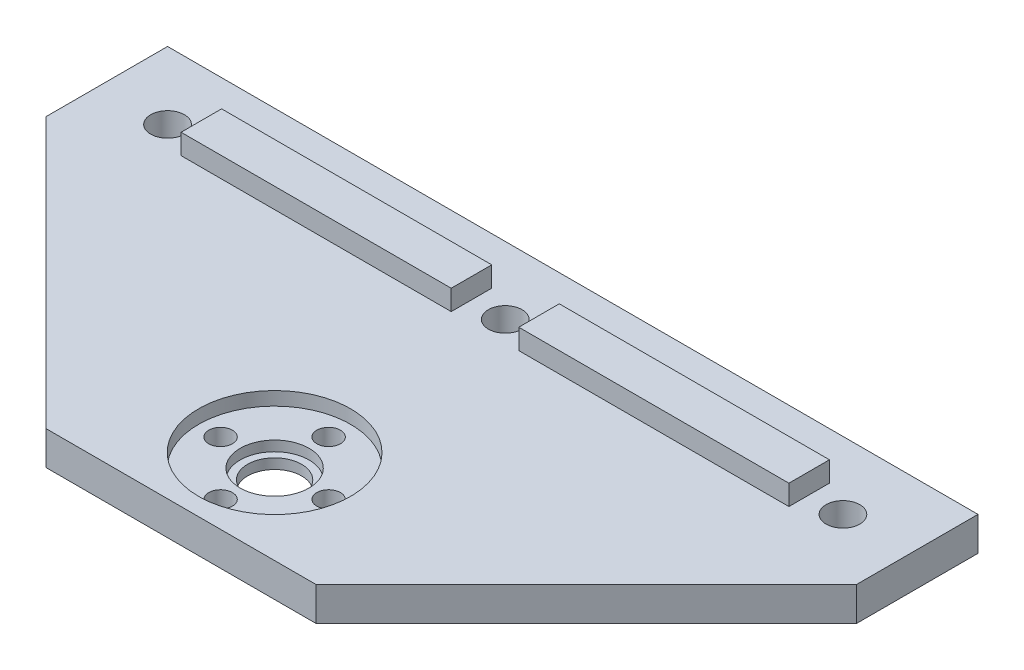
ISO-10303-21;
HEADER;
FILE_DESCRIPTION(('STEP AP214'),'2;1');
FILE_NAME('part.step','',(''),(''),'','','');
FILE_SCHEMA(('AUTOMOTIVE_DESIGN { 1 0 10303 214 1 1 1 1 }'));
ENDSEC;
DATA;
#1=APPLICATION_CONTEXT('core data for automotive mechanical design processes');
#2=APPLICATION_PROTOCOL_DEFINITION('international standard','automotive_design',2000,#1);
#3=PRODUCT_CONTEXT('',#1,'mechanical');
#4=PRODUCT('Part','Part','',(#3));
#5=PRODUCT_RELATED_PRODUCT_CATEGORY('part','',(#4));
#6=PRODUCT_DEFINITION_FORMATION('','',#4);
#7=PRODUCT_DEFINITION_CONTEXT('part definition',#1,'design');
#8=PRODUCT_DEFINITION('design','',#6,#7);
#9=PRODUCT_DEFINITION_SHAPE('','',#8);
#10=(LENGTH_UNIT() NAMED_UNIT(*) SI_UNIT(.MILLI.,.METRE.));
#11=(NAMED_UNIT(*) PLANE_ANGLE_UNIT() SI_UNIT($,.RADIAN.));
#12=(NAMED_UNIT(*) SI_UNIT($,.STERADIAN.) SOLID_ANGLE_UNIT());
#13=UNCERTAINTY_MEASURE_WITH_UNIT(LENGTH_MEASURE(1.E-05),#10,'distance_accuracy_value','');
#14=(GEOMETRIC_REPRESENTATION_CONTEXT(3) GLOBAL_UNCERTAINTY_ASSIGNED_CONTEXT((#13)) GLOBAL_UNIT_ASSIGNED_CONTEXT((#10,
#11,#12)) REPRESENTATION_CONTEXT('',''));
#15=CARTESIAN_POINT('',(0.,0.,0.));
#16=DIRECTION('',(0.,0.,1.));
#17=DIRECTION('',(1.,0.,0.));
#18=AXIS2_PLACEMENT_3D('',#15,#16,#17);
#19=CARTESIAN_POINT('',(60.,-9.,-13.85));
#20=DIRECTION('',(0.,1.,0.));
#21=DIRECTION('',(0.,0.,1.));
#22=AXIS2_PLACEMENT_3D('',#19,#20,#21);
#23=CYLINDRICAL_SURFACE('',#22,4.00000000000001);
#24=CARTESIAN_POINT('',(60.,0.,-13.85));
#25=DIRECTION('',(0.,-1.,0.));
#26=DIRECTION('',(0.,0.,-1.));
#27=AXIS2_PLACEMENT_3D('',#24,#25,#26);
#28=CIRCLE('',#27,4.00000000000001);
#29=CARTESIAN_POINT('',(60.,0.,-17.85));
#30=VERTEX_POINT('',#29);
#31=EDGE_CURVE('E242',#30,#30,#28,.T.);
#32=ORIENTED_EDGE('',*,*,#31,.T.);
#33=EDGE_LOOP('',(#32));
#34=FACE_BOUND('',#33,.T.);
#35=CARTESIAN_POINT('',(60.,1.5,-13.85));
#36=DIRECTION('',(0.,1.,0.));
#37=DIRECTION('',(0.,0.,1.));
#38=AXIS2_PLACEMENT_3D('',#35,#36,#37);
#39=CIRCLE('',#38,4.00000000000001);
#40=CARTESIAN_POINT('',(60.,1.5,-9.84999999999999));
#41=VERTEX_POINT('',#40);
#42=EDGE_CURVE('E246',#41,#41,#39,.F.);
#43=ORIENTED_EDGE('',*,*,#42,.F.);
#44=EDGE_LOOP('',(#43));
#45=FACE_BOUND('',#44,.T.);
#46=ADVANCED_FACE('F33',(#34,#45),#23,.F.);
#47=CARTESIAN_POINT('',(0.,5.,0.));
#48=DIRECTION('',(0.,-1.,0.));
#49=DIRECTION('',(0.,0.,-1.));
#50=AXIS2_PLACEMENT_3D('',#47,#48,#49);
#51=PLANE('',#50);
#52=CARTESIAN_POINT('',(60.,5.,-13.85));
#53=DIRECTION('',(0.,1.,0.));
#54=DIRECTION('',(0.,0.,1.));
#55=AXIS2_PLACEMENT_3D('',#52,#53,#54);
#56=CIRCLE('',#55,11.25);
#57=CARTESIAN_POINT('',(60.,5.,-2.60000000000001));
#58=VERTEX_POINT('',#57);
#59=EDGE_CURVE('E245',#58,#58,#56,.T.);
#60=ORIENTED_EDGE('',*,*,#59,.F.);
#61=EDGE_LOOP('',(#60));
#62=FACE_BOUND('',#61,.T.);
#63=DIRECTION('',(0.,0.,1.));
#64=VECTOR('',#63,1.);
#65=CARTESIAN_POINT('',(15.,5.,-45.));
#66=LINE('',#65,#64);
#67=CARTESIAN_POINT('',(15.,5.,-51.));
#68=VERTEX_POINT('',#67);
#69=CARTESIAN_POINT('',(15.,5.,-45.));
#70=VERTEX_POINT('',#69);
#71=EDGE_CURVE('E162',#68,#70,#66,.T.);
#72=ORIENTED_EDGE('',*,*,#71,.F.);
#73=DIRECTION('',(-1.,0.,0.));
#74=VECTOR('',#73,1.);
#75=CARTESIAN_POINT('',(15.,5.,-51.));
#76=LINE('',#75,#74);
#77=CARTESIAN_POINT('',(55.,5.,-51.));
#78=VERTEX_POINT('',#77);
#79=EDGE_CURVE('E175',#78,#68,#76,.T.);
#80=ORIENTED_EDGE('',*,*,#79,.F.);
#81=DIRECTION('',(0.,0.,-1.));
#82=VECTOR('',#81,1.);
#83=CARTESIAN_POINT('',(55.,5.,-45.));
#84=LINE('',#83,#82);
#85=CARTESIAN_POINT('',(55.,5.,-45.));
#86=VERTEX_POINT('',#85);
#87=EDGE_CURVE('E184',#86,#78,#84,.T.);
#88=ORIENTED_EDGE('',*,*,#87,.F.);
#89=DIRECTION('',(1.,0.,0.));
#90=VECTOR('',#89,1.);
#91=CARTESIAN_POINT('',(15.,5.,-45.));
#92=LINE('',#91,#90);
#93=EDGE_CURVE('E165',#70,#86,#92,.T.);
#94=ORIENTED_EDGE('',*,*,#93,.F.);
#95=EDGE_LOOP('',(#72,#80,#88,#94));
#96=FACE_BOUND('',#95,.T.);
#97=CARTESIAN_POINT('',(10.,5.,-48.));
#98=DIRECTION('',(0.,1.,0.));
#99=DIRECTION('',(0.,0.,1.));
#100=AXIS2_PLACEMENT_3D('',#97,#98,#99);
#101=CIRCLE('',#100,2.5);
#102=CARTESIAN_POINT('',(10.,5.,-45.5));
#103=VERTEX_POINT('',#102);
#104=EDGE_CURVE('E205',#103,#103,#101,.T.);
#105=ORIENTED_EDGE('',*,*,#104,.F.);
#106=EDGE_LOOP('',(#105));
#107=FACE_BOUND('',#106,.T.);
#108=CARTESIAN_POINT('',(60.,5.,-48.));
#109=DIRECTION('',(0.,1.,0.));
#110=DIRECTION('',(0.,0.,1.));
#111=AXIS2_PLACEMENT_3D('',#108,#109,#110);
#112=CIRCLE('',#111,2.5);
#113=CARTESIAN_POINT('',(60.,5.,-45.5));
#114=VERTEX_POINT('',#113);
#115=EDGE_CURVE('E211',#114,#114,#112,.T.);
#116=ORIENTED_EDGE('',*,*,#115,.F.);
#117=EDGE_LOOP('',(#116));
#118=FACE_BOUND('',#117,.T.);
#119=CARTESIAN_POINT('',(110.,5.,-48.));
#120=DIRECTION('',(0.,1.,0.));
#121=DIRECTION('',(0.,0.,1.));
#122=AXIS2_PLACEMENT_3D('',#119,#120,#121);
#123=CIRCLE('',#122,2.50000000000001);
#124=CARTESIAN_POINT('',(110.,5.,-45.5));
#125=VERTEX_POINT('',#124);
#126=EDGE_CURVE('E200',#125,#125,#123,.T.);
#127=ORIENTED_EDGE('',*,*,#126,.F.);
#128=EDGE_LOOP('',(#127));
#129=FACE_BOUND('',#128,.T.);
#130=DIRECTION('',(0.,0.,1.));
#131=VECTOR('',#130,1.);
#132=CARTESIAN_POINT('',(0.,5.,0.));
#133=LINE('',#132,#131);
#134=CARTESIAN_POINT('',(0.,5.,-58.));
#135=VERTEX_POINT('',#134);
#136=CARTESIAN_POINT('',(0.,5.,-40.0000000000001));
#137=VERTEX_POINT('',#136);
#138=EDGE_CURVE('E219',#135,#137,#133,.T.);
#139=ORIENTED_EDGE('',*,*,#138,.T.);
#140=DIRECTION('',(-0.707106781186546,0.,-0.707106781186549));
#141=VECTOR('',#140,1.);
#142=CARTESIAN_POINT('',(40.,5.,0.));
#143=LINE('',#142,#141);
#144=CARTESIAN_POINT('',(40.,5.,0.));
#145=VERTEX_POINT('',#144);
#146=EDGE_CURVE('E41',#137,#145,#143,.F.);
#147=ORIENTED_EDGE('',*,*,#146,.T.);
#148=DIRECTION('',(1.,0.,0.));
#149=VECTOR('',#148,1.);
#150=CARTESIAN_POINT('',(0.,5.,0.));
#151=LINE('',#150,#149);
#152=CARTESIAN_POINT('',(79.9999999999999,5.,0.));
#153=VERTEX_POINT('',#152);
#154=EDGE_CURVE('E221',#145,#153,#151,.T.);
#155=ORIENTED_EDGE('',*,*,#154,.T.);
#156=DIRECTION('',(-0.707106781186549,0.,0.707106781186546));
#157=VECTOR('',#156,1.);
#158=CARTESIAN_POINT('',(120.,5.,-40.));
#159=LINE('',#158,#157);
#160=CARTESIAN_POINT('',(120.,5.,-40.));
#161=VERTEX_POINT('',#160);
#162=EDGE_CURVE('E48',#153,#161,#159,.F.);
#163=ORIENTED_EDGE('',*,*,#162,.T.);
#164=DIRECTION('',(0.,0.,-1.));
#165=VECTOR('',#164,1.);
#166=CARTESIAN_POINT('',(120.,5.,0.));
#167=LINE('',#166,#165);
#168=CARTESIAN_POINT('',(120.,5.,-58.));
#169=VERTEX_POINT('',#168);
#170=EDGE_CURVE('E224',#161,#169,#167,.T.);
#171=ORIENTED_EDGE('',*,*,#170,.T.);
#172=DIRECTION('',(-1.,0.,0.));
#173=VECTOR('',#172,1.);
#174=CARTESIAN_POINT('',(0.,5.,-58.));
#175=LINE('',#174,#173);
#176=EDGE_CURVE('E226',#169,#135,#175,.T.);
#177=ORIENTED_EDGE('',*,*,#176,.T.);
#178=EDGE_LOOP('',(#139,#147,#155,#163,#171,#177));
#179=FACE_BOUND('',#178,.T.);
#180=DIRECTION('',(0.,0.,1.));
#181=VECTOR('',#180,1.);
#182=CARTESIAN_POINT('',(65.,5.,-45.));
#183=LINE('',#182,#181);
#184=CARTESIAN_POINT('',(65.,5.,-51.));
#185=VERTEX_POINT('',#184);
#186=CARTESIAN_POINT('',(65.,5.,-45.));
#187=VERTEX_POINT('',#186);
#188=EDGE_CURVE('E161',#185,#187,#183,.T.);
#189=ORIENTED_EDGE('',*,*,#188,.F.);
#190=DIRECTION('',(-1.,0.,0.));
#191=VECTOR('',#190,1.);
#192=CARTESIAN_POINT('',(65.,5.,-51.));
#193=LINE('',#192,#191);
#194=CARTESIAN_POINT('',(105.,5.,-51.));
#195=VERTEX_POINT('',#194);
#196=EDGE_CURVE('E158',#195,#185,#193,.T.);
#197=ORIENTED_EDGE('',*,*,#196,.F.);
#198=DIRECTION('',(0.,0.,-1.));
#199=VECTOR('',#198,1.);
#200=CARTESIAN_POINT('',(105.,5.,-45.));
#201=LINE('',#200,#199);
#202=CARTESIAN_POINT('',(105.,5.,-45.));
#203=VERTEX_POINT('',#202);
#204=EDGE_CURVE('E607',#203,#195,#201,.T.);
#205=ORIENTED_EDGE('',*,*,#204,.F.);
#206=DIRECTION('',(1.,0.,0.));
#207=VECTOR('',#206,1.);
#208=CARTESIAN_POINT('',(65.,5.,-45.));
#209=LINE('',#208,#207);
#210=EDGE_CURVE('E605',#187,#203,#209,.T.);
#211=ORIENTED_EDGE('',*,*,#210,.F.);
#212=EDGE_LOOP('',(#189,#197,#205,#211));
#213=FACE_BOUND('',#212,.T.);
#214=ADVANCED_FACE('F261',(#62,#96,#107,#118,#129,#179,#213),#51,.F.);
#215=CARTESIAN_POINT('',(0.,5.,0.));
#216=DIRECTION('',(1.,0.,0.));
#217=DIRECTION('',(0.,0.,-1.));
#218=AXIS2_PLACEMENT_3D('',#215,#216,#217);
#219=PLANE('',#218);
#220=DIRECTION('',(0.,0.,1.));
#221=VECTOR('',#220,1.);
#222=CARTESIAN_POINT('',(0.,0.,0.));
#223=LINE('',#222,#221);
#224=CARTESIAN_POINT('',(0.,0.,-58.));
#225=VERTEX_POINT('',#224);
#226=CARTESIAN_POINT('',(0.,0.,-40.0000000000001));
#227=VERTEX_POINT('',#226);
#228=EDGE_CURVE('E204',#225,#227,#223,.T.);
#229=ORIENTED_EDGE('',*,*,#228,.T.);
#230=DIRECTION('',(0.,1.,0.));
#231=VECTOR('',#230,1.);
#232=CARTESIAN_POINT('',(0.,5.,-40.0000000000001));
#233=LINE('',#232,#231);
#234=EDGE_CURVE('E56',#227,#137,#233,.T.);
#235=ORIENTED_EDGE('',*,*,#234,.T.);
#236=ORIENTED_EDGE('',*,*,#138,.F.);
#237=DIRECTION('',(0.,-1.,0.));
#238=VECTOR('',#237,1.);
#239=CARTESIAN_POINT('',(0.,5.,-58.));
#240=LINE('',#239,#238);
#241=EDGE_CURVE('E228',#135,#225,#240,.T.);
#242=ORIENTED_EDGE('',*,*,#241,.T.);
#243=EDGE_LOOP('',(#229,#235,#236,#242));
#244=FACE_BOUND('',#243,.T.);
#245=ADVANCED_FACE('F274',(#244),#219,.F.);
#246=CARTESIAN_POINT('',(0.,5.,0.));
#247=DIRECTION('',(0.,0.,-1.));
#248=DIRECTION('',(-1.,0.,0.));
#249=AXIS2_PLACEMENT_3D('',#246,#247,#248);
#250=PLANE('',#249);
#251=ORIENTED_EDGE('',*,*,#154,.F.);
#252=DIRECTION('',(0.,-1.,0.));
#253=VECTOR('',#252,1.);
#254=CARTESIAN_POINT('',(40.,5.,0.));
#255=LINE('',#254,#253);
#256=CARTESIAN_POINT('',(40.,0.,0.));
#257=VERTEX_POINT('',#256);
#258=EDGE_CURVE('E251',#145,#257,#255,.T.);
#259=ORIENTED_EDGE('',*,*,#258,.T.);
#260=DIRECTION('',(1.,0.,0.));
#261=VECTOR('',#260,1.);
#262=CARTESIAN_POINT('',(0.,0.,0.));
#263=LINE('',#262,#261);
#264=CARTESIAN_POINT('',(79.9999999999999,0.,0.));
#265=VERTEX_POINT('',#264);
#266=EDGE_CURVE('E230',#257,#265,#263,.T.);
#267=ORIENTED_EDGE('',*,*,#266,.T.);
#268=DIRECTION('',(0.,1.,0.));
#269=VECTOR('',#268,1.);
#270=CARTESIAN_POINT('',(79.9999999999999,5.,0.));
#271=LINE('',#270,#269);
#272=EDGE_CURVE('E241',#265,#153,#271,.T.);
#273=ORIENTED_EDGE('',*,*,#272,.T.);
#274=EDGE_LOOP('',(#251,#259,#267,#273));
#275=FACE_BOUND('',#274,.T.);
#276=ADVANCED_FACE('F266',(#275),#250,.F.);
#277=CARTESIAN_POINT('',(120.,5.,0.));
#278=DIRECTION('',(-1.,0.,0.));
#279=DIRECTION('',(0.,0.,1.));
#280=AXIS2_PLACEMENT_3D('',#277,#278,#279);
#281=PLANE('',#280);
#282=ORIENTED_EDGE('',*,*,#170,.F.);
#283=DIRECTION('',(0.,-1.,0.));
#284=VECTOR('',#283,1.);
#285=CARTESIAN_POINT('',(120.,5.,-40.));
#286=LINE('',#285,#284);
#287=CARTESIAN_POINT('',(120.,0.,-40.));
#288=VERTEX_POINT('',#287);
#289=EDGE_CURVE('E11',#161,#288,#286,.T.);
#290=ORIENTED_EDGE('',*,*,#289,.T.);
#291=DIRECTION('',(0.,0.,-1.));
#292=VECTOR('',#291,1.);
#293=CARTESIAN_POINT('',(120.,0.,0.));
#294=LINE('',#293,#292);
#295=CARTESIAN_POINT('',(120.,0.,-58.));
#296=VERTEX_POINT('',#295);
#297=EDGE_CURVE('E233',#288,#296,#294,.T.);
#298=ORIENTED_EDGE('',*,*,#297,.T.);
#299=DIRECTION('',(0.,-1.,0.));
#300=VECTOR('',#299,1.);
#301=CARTESIAN_POINT('',(120.,5.,-58.));
#302=LINE('',#301,#300);
#303=EDGE_CURVE('E238',#169,#296,#302,.T.);
#304=ORIENTED_EDGE('',*,*,#303,.F.);
#305=EDGE_LOOP('',(#282,#290,#298,#304));
#306=FACE_BOUND('',#305,.T.);
#307=ADVANCED_FACE('F282',(#306),#281,.F.);
#308=CARTESIAN_POINT('',(0.,5.,-58.));
#309=DIRECTION('',(0.,0.,1.));
#310=DIRECTION('',(1.,0.,0.));
#311=AXIS2_PLACEMENT_3D('',#308,#309,#310);
#312=PLANE('',#311);
#313=DIRECTION('',(-1.,0.,0.));
#314=VECTOR('',#313,1.);
#315=CARTESIAN_POINT('',(0.,0.,-58.));
#316=LINE('',#315,#314);
#317=EDGE_CURVE('E222',#296,#225,#316,.T.);
#318=ORIENTED_EDGE('',*,*,#317,.T.);
#319=ORIENTED_EDGE('',*,*,#241,.F.);
#320=ORIENTED_EDGE('',*,*,#176,.F.);
#321=ORIENTED_EDGE('',*,*,#303,.T.);
#322=EDGE_LOOP('',(#318,#319,#320,#321));
#323=FACE_BOUND('',#322,.T.);
#324=ADVANCED_FACE('F278',(#323),#312,.F.);
#325=CARTESIAN_POINT('',(0.,0.,0.));
#326=DIRECTION('',(0.,-1.,0.));
#327=DIRECTION('',(0.,0.,-1.));
#328=AXIS2_PLACEMENT_3D('',#325,#326,#327);
#329=PLANE('',#328);
#330=CARTESIAN_POINT('',(52.,0.,-13.85));
#331=DIRECTION('',(0.,-1.,0.));
#332=DIRECTION('',(0.,0.,-1.));
#333=AXIS2_PLACEMENT_3D('',#330,#331,#332);
#334=CIRCLE('',#333,1.75);
#335=CARTESIAN_POINT('',(52.,0.,-15.6));
#336=VERTEX_POINT('',#335);
#337=EDGE_CURVE('E566',#336,#336,#334,.T.);
#338=ORIENTED_EDGE('',*,*,#337,.F.);
#339=EDGE_LOOP('',(#338));
#340=FACE_BOUND('',#339,.T.);
#341=CARTESIAN_POINT('',(60.,0.,-21.85));
#342=DIRECTION('',(0.,-1.,0.));
#343=DIRECTION('',(0.,0.,-1.));
#344=AXIS2_PLACEMENT_3D('',#341,#342,#343);
#345=CIRCLE('',#344,1.75);
#346=CARTESIAN_POINT('',(60.,0.,-23.6));
#347=VERTEX_POINT('',#346);
#348=EDGE_CURVE('E587',#347,#347,#345,.T.);
#349=ORIENTED_EDGE('',*,*,#348,.F.);
#350=EDGE_LOOP('',(#349));
#351=FACE_BOUND('',#350,.T.);
#352=CARTESIAN_POINT('',(68.,0.,-13.85));
#353=DIRECTION('',(0.,-1.,0.));
#354=DIRECTION('',(0.,0.,-1.));
#355=AXIS2_PLACEMENT_3D('',#352,#353,#354);
#356=CIRCLE('',#355,1.75);
#357=CARTESIAN_POINT('',(68.,0.,-15.6));
#358=VERTEX_POINT('',#357);
#359=EDGE_CURVE('E574',#358,#358,#356,.T.);
#360=ORIENTED_EDGE('',*,*,#359,.F.);
#361=EDGE_LOOP('',(#360));
#362=FACE_BOUND('',#361,.T.);
#363=CARTESIAN_POINT('',(60.,0.,-5.85));
#364=DIRECTION('',(0.,-1.,0.));
#365=DIRECTION('',(0.,0.,-1.));
#366=AXIS2_PLACEMENT_3D('',#363,#364,#365);
#367=CIRCLE('',#366,1.75);
#368=CARTESIAN_POINT('',(60.,0.,-7.6));
#369=VERTEX_POINT('',#368);
#370=EDGE_CURVE('E570',#369,#369,#367,.T.);
#371=ORIENTED_EDGE('',*,*,#370,.F.);
#372=EDGE_LOOP('',(#371));
#373=FACE_BOUND('',#372,.T.);
#374=ORIENTED_EDGE('',*,*,#31,.F.);
#375=EDGE_LOOP('',(#374));
#376=FACE_BOUND('',#375,.T.);
#377=CARTESIAN_POINT('',(10.,0.,-48.));
#378=DIRECTION('',(0.,1.,0.));
#379=DIRECTION('',(0.,0.,1.));
#380=AXIS2_PLACEMENT_3D('',#377,#378,#379);
#381=CIRCLE('',#380,2.5);
#382=CARTESIAN_POINT('',(10.,0.,-45.5));
#383=VERTEX_POINT('',#382);
#384=EDGE_CURVE('E201',#383,#383,#381,.T.);
#385=ORIENTED_EDGE('',*,*,#384,.T.);
#386=EDGE_LOOP('',(#385));
#387=FACE_BOUND('',#386,.T.);
#388=CARTESIAN_POINT('',(60.,0.,-48.));
#389=DIRECTION('',(0.,1.,0.));
#390=DIRECTION('',(0.,0.,1.));
#391=AXIS2_PLACEMENT_3D('',#388,#389,#390);
#392=CIRCLE('',#391,2.5);
#393=CARTESIAN_POINT('',(60.,0.,-45.5));
#394=VERTEX_POINT('',#393);
#395=EDGE_CURVE('E208',#394,#394,#392,.T.);
#396=ORIENTED_EDGE('',*,*,#395,.T.);
#397=EDGE_LOOP('',(#396));
#398=FACE_BOUND('',#397,.T.);
#399=CARTESIAN_POINT('',(110.,0.,-48.));
#400=DIRECTION('',(0.,1.,0.));
#401=DIRECTION('',(0.,0.,1.));
#402=AXIS2_PLACEMENT_3D('',#399,#400,#401);
#403=CIRCLE('',#402,2.50000000000001);
#404=CARTESIAN_POINT('',(110.,0.,-45.5));
#405=VERTEX_POINT('',#404);
#406=EDGE_CURVE('E214',#405,#405,#403,.T.);
#407=ORIENTED_EDGE('',*,*,#406,.T.);
#408=EDGE_LOOP('',(#407));
#409=FACE_BOUND('',#408,.T.);
#410=ORIENTED_EDGE('',*,*,#266,.F.);
#411=DIRECTION('',(0.707106781186546,0.,0.707106781186549));
#412=VECTOR('',#411,1.);
#413=CARTESIAN_POINT('',(20.0000000000001,0.,-20.));
#414=LINE('',#413,#412);
#415=EDGE_CURVE('E256',#257,#227,#414,.F.);
#416=ORIENTED_EDGE('',*,*,#415,.T.);
#417=ORIENTED_EDGE('',*,*,#228,.F.);
#418=ORIENTED_EDGE('',*,*,#317,.F.);
#419=ORIENTED_EDGE('',*,*,#297,.F.);
#420=DIRECTION('',(0.707106781186549,0.,-0.707106781186546));
#421=VECTOR('',#420,1.);
#422=CARTESIAN_POINT('',(39.9999999999998,0.,39.9999999999999));
#423=LINE('',#422,#421);
#424=EDGE_CURVE('E254',#288,#265,#423,.F.);
#425=ORIENTED_EDGE('',*,*,#424,.T.);
#426=EDGE_LOOP('',(#410,#416,#417,#418,#419,#425));
#427=FACE_BOUND('',#426,.T.);
#428=ADVANCED_FACE('F272',(#340,#351,#362,#373,#376,#387,#398,#409,#427),#329,.T.);
#429=CARTESIAN_POINT('',(110.,0.,-48.));
#430=DIRECTION('',(0.,1.,0.));
#431=DIRECTION('',(0.,0.,1.));
#432=AXIS2_PLACEMENT_3D('',#429,#430,#431);
#433=CYLINDRICAL_SURFACE('',#432,2.50000000000001);
#434=ORIENTED_EDGE('',*,*,#406,.F.);
#435=EDGE_LOOP('',(#434));
#436=FACE_BOUND('',#435,.T.);
#437=ORIENTED_EDGE('',*,*,#126,.T.);
#438=EDGE_LOOP('',(#437));
#439=FACE_BOUND('',#438,.T.);
#440=ADVANCED_FACE('F353',(#436,#439),#433,.F.);
#441=CARTESIAN_POINT('',(60.,0.,-48.));
#442=DIRECTION('',(0.,1.,0.));
#443=DIRECTION('',(0.,0.,1.));
#444=AXIS2_PLACEMENT_3D('',#441,#442,#443);
#445=CYLINDRICAL_SURFACE('',#444,2.5);
#446=ORIENTED_EDGE('',*,*,#395,.F.);
#447=EDGE_LOOP('',(#446));
#448=FACE_BOUND('',#447,.T.);
#449=ORIENTED_EDGE('',*,*,#115,.T.);
#450=EDGE_LOOP('',(#449));
#451=FACE_BOUND('',#450,.T.);
#452=ADVANCED_FACE('F349',(#448,#451),#445,.F.);
#453=CARTESIAN_POINT('',(10.,0.,-48.));
#454=DIRECTION('',(0.,1.,0.));
#455=DIRECTION('',(0.,0.,1.));
#456=AXIS2_PLACEMENT_3D('',#453,#454,#455);
#457=CYLINDRICAL_SURFACE('',#456,2.5);
#458=ORIENTED_EDGE('',*,*,#384,.F.);
#459=EDGE_LOOP('',(#458));
#460=FACE_BOUND('',#459,.T.);
#461=ORIENTED_EDGE('',*,*,#104,.T.);
#462=EDGE_LOOP('',(#461));
#463=FACE_BOUND('',#462,.T.);
#464=ADVANCED_FACE('F345',(#460,#463),#457,.F.);
#465=CARTESIAN_POINT('',(15.,8.,-45.));
#466=DIRECTION('',(1.,0.,0.));
#467=DIRECTION('',(0.,0.,-1.));
#468=AXIS2_PLACEMENT_3D('',#465,#466,#467);
#469=PLANE('',#468);
#470=ORIENTED_EDGE('',*,*,#71,.T.);
#471=DIRECTION('',(0.,-1.,0.));
#472=VECTOR('',#471,1.);
#473=CARTESIAN_POINT('',(15.,8.,-45.));
#474=LINE('',#473,#472);
#475=CARTESIAN_POINT('',(15.,8.,-45.));
#476=VERTEX_POINT('',#475);
#477=EDGE_CURVE('E197',#476,#70,#474,.T.);
#478=ORIENTED_EDGE('',*,*,#477,.F.);
#479=DIRECTION('',(0.,0.,1.));
#480=VECTOR('',#479,1.);
#481=CARTESIAN_POINT('',(15.,8.,-45.));
#482=LINE('',#481,#480);
#483=CARTESIAN_POINT('',(15.,8.,-51.));
#484=VERTEX_POINT('',#483);
#485=EDGE_CURVE('E171',#484,#476,#482,.T.);
#486=ORIENTED_EDGE('',*,*,#485,.F.);
#487=DIRECTION('',(0.,-1.,0.));
#488=VECTOR('',#487,1.);
#489=CARTESIAN_POINT('',(15.,8.,-51.));
#490=LINE('',#489,#488);
#491=EDGE_CURVE('E180',#484,#68,#490,.T.);
#492=ORIENTED_EDGE('',*,*,#491,.T.);
#493=EDGE_LOOP('',(#470,#478,#486,#492));
#494=FACE_BOUND('',#493,.T.);
#495=ADVANCED_FACE('F341',(#494),#469,.F.);
#496=CARTESIAN_POINT('',(15.,8.,-45.));
#497=DIRECTION('',(0.,0.,-1.));
#498=DIRECTION('',(-1.,0.,0.));
#499=AXIS2_PLACEMENT_3D('',#496,#497,#498);
#500=PLANE('',#499);
#501=ORIENTED_EDGE('',*,*,#93,.T.);
#502=DIRECTION('',(0.,-1.,0.));
#503=VECTOR('',#502,1.);
#504=CARTESIAN_POINT('',(55.,8.,-45.));
#505=LINE('',#504,#503);
#506=CARTESIAN_POINT('',(55.,8.,-45.));
#507=VERTEX_POINT('',#506);
#508=EDGE_CURVE('E194',#507,#86,#505,.T.);
#509=ORIENTED_EDGE('',*,*,#508,.F.);
#510=DIRECTION('',(1.,0.,0.));
#511=VECTOR('',#510,1.);
#512=CARTESIAN_POINT('',(15.,8.,-45.));
#513=LINE('',#512,#511);
#514=EDGE_CURVE('E174',#476,#507,#513,.T.);
#515=ORIENTED_EDGE('',*,*,#514,.F.);
#516=ORIENTED_EDGE('',*,*,#477,.T.);
#517=EDGE_LOOP('',(#501,#509,#515,#516));
#518=FACE_BOUND('',#517,.T.);
#519=ADVANCED_FACE('F337',(#518),#500,.F.);
#520=CARTESIAN_POINT('',(55.,8.,-45.));
#521=DIRECTION('',(-1.,0.,0.));
#522=DIRECTION('',(0.,0.,1.));
#523=AXIS2_PLACEMENT_3D('',#520,#521,#522);
#524=PLANE('',#523);
#525=ORIENTED_EDGE('',*,*,#87,.T.);
#526=DIRECTION('',(0.,-1.,0.));
#527=VECTOR('',#526,1.);
#528=CARTESIAN_POINT('',(55.,8.,-51.));
#529=LINE('',#528,#527);
#530=CARTESIAN_POINT('',(55.,8.,-51.));
#531=VERTEX_POINT('',#530);
#532=EDGE_CURVE('E191',#531,#78,#529,.T.);
#533=ORIENTED_EDGE('',*,*,#532,.F.);
#534=DIRECTION('',(0.,0.,-1.));
#535=VECTOR('',#534,1.);
#536=CARTESIAN_POINT('',(55.,8.,-45.));
#537=LINE('',#536,#535);
#538=EDGE_CURVE('E177',#507,#531,#537,.T.);
#539=ORIENTED_EDGE('',*,*,#538,.F.);
#540=ORIENTED_EDGE('',*,*,#508,.T.);
#541=EDGE_LOOP('',(#525,#533,#539,#540));
#542=FACE_BOUND('',#541,.T.);
#543=ADVANCED_FACE('F333',(#542),#524,.F.);
#544=CARTESIAN_POINT('',(15.,8.,-51.));
#545=DIRECTION('',(0.,0.,1.));
#546=DIRECTION('',(1.,0.,0.));
#547=AXIS2_PLACEMENT_3D('',#544,#545,#546);
#548=PLANE('',#547);
#549=ORIENTED_EDGE('',*,*,#79,.T.);
#550=ORIENTED_EDGE('',*,*,#491,.F.);
#551=DIRECTION('',(-1.,0.,0.));
#552=VECTOR('',#551,1.);
#553=CARTESIAN_POINT('',(15.,8.,-51.));
#554=LINE('',#553,#552);
#555=EDGE_CURVE('E179',#531,#484,#554,.T.);
#556=ORIENTED_EDGE('',*,*,#555,.F.);
#557=ORIENTED_EDGE('',*,*,#532,.T.);
#558=EDGE_LOOP('',(#549,#550,#556,#557));
#559=FACE_BOUND('',#558,.T.);
#560=ADVANCED_FACE('F329',(#559),#548,.F.);
#561=CARTESIAN_POINT('',(0.,8.,0.));
#562=DIRECTION('',(0.,-1.,0.));
#563=DIRECTION('',(0.,0.,-1.));
#564=AXIS2_PLACEMENT_3D('',#561,#562,#563);
#565=PLANE('',#564);
#566=ORIENTED_EDGE('',*,*,#485,.T.);
#567=ORIENTED_EDGE('',*,*,#514,.T.);
#568=ORIENTED_EDGE('',*,*,#538,.T.);
#569=ORIENTED_EDGE('',*,*,#555,.T.);
#570=EDGE_LOOP('',(#566,#567,#568,#569));
#571=FACE_BOUND('',#570,.T.);
#572=ADVANCED_FACE('F326',(#571),#565,.F.);
#573=CARTESIAN_POINT('',(65.,8.,-45.));
#574=DIRECTION('',(1.,0.,0.));
#575=DIRECTION('',(0.,0.,-1.));
#576=AXIS2_PLACEMENT_3D('',#573,#574,#575);
#577=PLANE('',#576);
#578=ORIENTED_EDGE('',*,*,#188,.T.);
#579=DIRECTION('',(0.,-1.,0.));
#580=VECTOR('',#579,1.);
#581=CARTESIAN_POINT('',(65.,8.,-45.));
#582=LINE('',#581,#580);
#583=CARTESIAN_POINT('',(65.,8.,-45.));
#584=VERTEX_POINT('',#583);
#585=EDGE_CURVE('E142',#584,#187,#582,.T.);
#586=ORIENTED_EDGE('',*,*,#585,.F.);
#587=DIRECTION('',(0.,0.,1.));
#588=VECTOR('',#587,1.);
#589=CARTESIAN_POINT('',(65.,8.,-45.));
#590=LINE('',#589,#588);
#591=CARTESIAN_POINT('',(65.,8.,-51.));
#592=VERTEX_POINT('',#591);
#593=EDGE_CURVE('E149',#592,#584,#590,.T.);
#594=ORIENTED_EDGE('',*,*,#593,.F.);
#595=DIRECTION('',(0.,-1.,0.));
#596=VECTOR('',#595,1.);
#597=CARTESIAN_POINT('',(65.,8.,-51.));
#598=LINE('',#597,#596);
#599=EDGE_CURVE('E603',#592,#185,#598,.T.);
#600=ORIENTED_EDGE('',*,*,#599,.T.);
#601=EDGE_LOOP('',(#578,#586,#594,#600));
#602=FACE_BOUND('',#601,.T.);
#603=ADVANCED_FACE('F160',(#602),#577,.F.);
#604=CARTESIAN_POINT('',(65.,8.,-45.));
#605=DIRECTION('',(0.,0.,-1.));
#606=DIRECTION('',(-1.,0.,0.));
#607=AXIS2_PLACEMENT_3D('',#604,#605,#606);
#608=PLANE('',#607);
#609=ORIENTED_EDGE('',*,*,#210,.T.);
#610=DIRECTION('',(0.,-1.,0.));
#611=VECTOR('',#610,1.);
#612=CARTESIAN_POINT('',(105.,8.,-45.));
#613=LINE('',#612,#611);
#614=CARTESIAN_POINT('',(105.,8.,-45.));
#615=VERTEX_POINT('',#614);
#616=EDGE_CURVE('E145',#615,#203,#613,.T.);
#617=ORIENTED_EDGE('',*,*,#616,.F.);
#618=DIRECTION('',(1.,0.,0.));
#619=VECTOR('',#618,1.);
#620=CARTESIAN_POINT('',(65.,8.,-45.));
#621=LINE('',#620,#619);
#622=EDGE_CURVE('E137',#584,#615,#621,.T.);
#623=ORIENTED_EDGE('',*,*,#622,.F.);
#624=ORIENTED_EDGE('',*,*,#585,.T.);
#625=EDGE_LOOP('',(#609,#617,#623,#624));
#626=FACE_BOUND('',#625,.T.);
#627=ADVANCED_FACE('F140',(#626),#608,.F.);
#628=CARTESIAN_POINT('',(105.,8.,-45.));
#629=DIRECTION('',(-1.,0.,0.));
#630=DIRECTION('',(0.,0.,1.));
#631=AXIS2_PLACEMENT_3D('',#628,#629,#630);
#632=PLANE('',#631);
#633=ORIENTED_EDGE('',*,*,#204,.T.);
#634=DIRECTION('',(0.,-1.,0.));
#635=VECTOR('',#634,1.);
#636=CARTESIAN_POINT('',(105.,8.,-51.));
#637=LINE('',#636,#635);
#638=CARTESIAN_POINT('',(105.,8.,-51.));
#639=VERTEX_POINT('',#638);
#640=EDGE_CURVE('E167',#639,#195,#637,.T.);
#641=ORIENTED_EDGE('',*,*,#640,.F.);
#642=DIRECTION('',(0.,0.,-1.));
#643=VECTOR('',#642,1.);
#644=CARTESIAN_POINT('',(105.,8.,-45.));
#645=LINE('',#644,#643);
#646=EDGE_CURVE('E148',#615,#639,#645,.T.);
#647=ORIENTED_EDGE('',*,*,#646,.F.);
#648=ORIENTED_EDGE('',*,*,#616,.T.);
#649=EDGE_LOOP('',(#633,#641,#647,#648));
#650=FACE_BOUND('',#649,.T.);
#651=ADVANCED_FACE('F317',(#650),#632,.F.);
#652=CARTESIAN_POINT('',(65.,8.,-51.));
#653=DIRECTION('',(0.,0.,1.));
#654=DIRECTION('',(1.,0.,0.));
#655=AXIS2_PLACEMENT_3D('',#652,#653,#654);
#656=PLANE('',#655);
#657=ORIENTED_EDGE('',*,*,#196,.T.);
#658=ORIENTED_EDGE('',*,*,#599,.F.);
#659=DIRECTION('',(-1.,0.,0.));
#660=VECTOR('',#659,1.);
#661=CARTESIAN_POINT('',(65.,8.,-51.));
#662=LINE('',#661,#660);
#663=EDGE_CURVE('E154',#639,#592,#662,.T.);
#664=ORIENTED_EDGE('',*,*,#663,.F.);
#665=ORIENTED_EDGE('',*,*,#640,.T.);
#666=EDGE_LOOP('',(#657,#658,#664,#665));
#667=FACE_BOUND('',#666,.T.);
#668=ADVANCED_FACE('F314',(#667),#656,.F.);
#669=CARTESIAN_POINT('',(0.,8.,0.));
#670=DIRECTION('',(0.,-1.,0.));
#671=DIRECTION('',(0.,0.,-1.));
#672=AXIS2_PLACEMENT_3D('',#669,#670,#671);
#673=PLANE('',#672);
#674=ORIENTED_EDGE('',*,*,#593,.T.);
#675=ORIENTED_EDGE('',*,*,#622,.T.);
#676=ORIENTED_EDGE('',*,*,#646,.T.);
#677=ORIENTED_EDGE('',*,*,#663,.T.);
#678=EDGE_LOOP('',(#674,#675,#676,#677));
#679=FACE_BOUND('',#678,.T.);
#680=ADVANCED_FACE('F152',(#679),#673,.F.);
#681=CARTESIAN_POINT('',(60.,3.,-13.85));
#682=DIRECTION('',(0.,1.,0.));
#683=DIRECTION('',(0.,0.,1.));
#684=AXIS2_PLACEMENT_3D('',#681,#682,#683);
#685=CYLINDRICAL_SURFACE('',#684,11.25);
#686=CARTESIAN_POINT('',(60.,3.,-13.85));
#687=DIRECTION('',(0.,1.,0.));
#688=DIRECTION('',(0.,0.,1.));
#689=AXIS2_PLACEMENT_3D('',#686,#687,#688);
#690=CIRCLE('',#689,11.25);
#691=CARTESIAN_POINT('',(60.,3.,-2.60000000000001));
#692=VERTEX_POINT('',#691);
#693=EDGE_CURVE('E596',#692,#692,#690,.T.);
#694=ORIENTED_EDGE('',*,*,#693,.F.);
#695=EDGE_LOOP('',(#694));
#696=FACE_BOUND('',#695,.T.);
#697=ORIENTED_EDGE('',*,*,#59,.T.);
#698=EDGE_LOOP('',(#697));
#699=FACE_BOUND('',#698,.T.);
#700=ADVANCED_FACE('F307',(#696,#699),#685,.F.);
#701=CARTESIAN_POINT('',(60.,3.,-13.85));
#702=DIRECTION('',(0.,1.,0.));
#703=DIRECTION('',(0.,0.,1.));
#704=AXIS2_PLACEMENT_3D('',#701,#702,#703);
#705=PLANE('',#704);
#706=CARTESIAN_POINT('',(52.,3.,-13.85));
#707=DIRECTION('',(0.,1.,0.));
#708=DIRECTION('',(0.,0.,1.));
#709=AXIS2_PLACEMENT_3D('',#706,#707,#708);
#710=CIRCLE('',#709,1.75);
#711=CARTESIAN_POINT('',(52.,3.,-12.1));
#712=VERTEX_POINT('',#711);
#713=EDGE_CURVE('E569',#712,#712,#710,.T.);
#714=ORIENTED_EDGE('',*,*,#713,.F.);
#715=EDGE_LOOP('',(#714));
#716=FACE_BOUND('',#715,.T.);
#717=CARTESIAN_POINT('',(60.,3.,-21.85));
#718=DIRECTION('',(0.,1.,0.));
#719=DIRECTION('',(0.,0.,1.));
#720=AXIS2_PLACEMENT_3D('',#717,#718,#719);
#721=CIRCLE('',#720,1.75);
#722=CARTESIAN_POINT('',(60.,3.,-20.1));
#723=VERTEX_POINT('',#722);
#724=EDGE_CURVE('E571',#723,#723,#721,.T.);
#725=ORIENTED_EDGE('',*,*,#724,.F.);
#726=EDGE_LOOP('',(#725));
#727=FACE_BOUND('',#726,.T.);
#728=CARTESIAN_POINT('',(68.,3.,-13.85));
#729=DIRECTION('',(0.,1.,0.));
#730=DIRECTION('',(0.,0.,1.));
#731=AXIS2_PLACEMENT_3D('',#728,#729,#730);
#732=CIRCLE('',#731,1.75);
#733=CARTESIAN_POINT('',(68.,3.,-12.1));
#734=VERTEX_POINT('',#733);
#735=EDGE_CURVE('E577',#734,#734,#732,.T.);
#736=ORIENTED_EDGE('',*,*,#735,.F.);
#737=EDGE_LOOP('',(#736));
#738=FACE_BOUND('',#737,.T.);
#739=CARTESIAN_POINT('',(60.,3.,-5.85));
#740=DIRECTION('',(0.,1.,0.));
#741=DIRECTION('',(0.,0.,1.));
#742=AXIS2_PLACEMENT_3D('',#739,#740,#741);
#743=CIRCLE('',#742,1.75);
#744=CARTESIAN_POINT('',(60.,3.,-4.1));
#745=VERTEX_POINT('',#744);
#746=EDGE_CURVE('E582',#745,#745,#743,.T.);
#747=ORIENTED_EDGE('',*,*,#746,.F.);
#748=EDGE_LOOP('',(#747));
#749=FACE_BOUND('',#748,.T.);
#750=CARTESIAN_POINT('',(60.,3.,-13.85));
#751=DIRECTION('',(0.,1.,0.));
#752=DIRECTION('',(0.,0.,1.));
#753=AXIS2_PLACEMENT_3D('',#750,#751,#752);
#754=CIRCLE('',#753,5.1);
#755=CARTESIAN_POINT('',(60.,3.,-8.75));
#756=VERTEX_POINT('',#755);
#757=EDGE_CURVE('E591',#756,#756,#754,.T.);
#758=ORIENTED_EDGE('',*,*,#757,.F.);
#759=EDGE_LOOP('',(#758));
#760=FACE_BOUND('',#759,.T.);
#761=ORIENTED_EDGE('',*,*,#693,.T.);
#762=EDGE_LOOP('',(#761));
#763=FACE_BOUND('',#762,.T.);
#764=ADVANCED_FACE('F303',(#716,#727,#738,#749,#760,#763),#705,.T.);
#765=CARTESIAN_POINT('',(60.,1.5,-13.85));
#766=DIRECTION('',(0.,1.,0.));
#767=DIRECTION('',(0.,0.,1.));
#768=AXIS2_PLACEMENT_3D('',#765,#766,#767);
#769=PLANE('',#768);
#770=CARTESIAN_POINT('',(60.,1.5,-13.85));
#771=DIRECTION('',(0.,1.,0.));
#772=DIRECTION('',(0.,0.,1.));
#773=AXIS2_PLACEMENT_3D('',#770,#771,#772);
#774=CIRCLE('',#773,5.1);
#775=CARTESIAN_POINT('',(60.,1.5,-8.75));
#776=VERTEX_POINT('',#775);
#777=EDGE_CURVE('E249',#776,#776,#774,.T.);
#778=ORIENTED_EDGE('',*,*,#777,.T.);
#779=EDGE_LOOP('',(#778));
#780=FACE_BOUND('',#779,.T.);
#781=ORIENTED_EDGE('',*,*,#42,.T.);
#782=EDGE_LOOP('',(#781));
#783=FACE_BOUND('',#782,.T.);
#784=ADVANCED_FACE('F306',(#780,#783),#769,.T.);
#785=CARTESIAN_POINT('',(60.,1.5,-13.85));
#786=DIRECTION('',(0.,1.,0.));
#787=DIRECTION('',(0.,0.,1.));
#788=AXIS2_PLACEMENT_3D('',#785,#786,#787);
#789=CYLINDRICAL_SURFACE('',#788,5.1);
#790=ORIENTED_EDGE('',*,*,#777,.F.);
#791=EDGE_LOOP('',(#790));
#792=FACE_BOUND('',#791,.T.);
#793=ORIENTED_EDGE('',*,*,#757,.T.);
#794=EDGE_LOOP('',(#793));
#795=FACE_BOUND('',#794,.T.);
#796=ADVANCED_FACE('F301',(#792,#795),#789,.F.);
#797=CARTESIAN_POINT('',(60.,-18.5,-5.85));
#798=DIRECTION('',(0.,1.,0.));
#799=DIRECTION('',(0.,0.,1.));
#800=AXIS2_PLACEMENT_3D('',#797,#798,#799);
#801=CYLINDRICAL_SURFACE('',#800,1.75);
#802=ORIENTED_EDGE('',*,*,#370,.T.);
#803=EDGE_LOOP('',(#802));
#804=FACE_BOUND('',#803,.T.);
#805=ORIENTED_EDGE('',*,*,#746,.T.);
#806=EDGE_LOOP('',(#805));
#807=FACE_BOUND('',#806,.T.);
#808=ADVANCED_FACE('F462',(#804,#807),#801,.F.);
#809=CARTESIAN_POINT('',(68.,-18.5,-13.85));
#810=DIRECTION('',(0.,1.,0.));
#811=DIRECTION('',(0.,0.,1.));
#812=AXIS2_PLACEMENT_3D('',#809,#810,#811);
#813=CYLINDRICAL_SURFACE('',#812,1.75);
#814=ORIENTED_EDGE('',*,*,#359,.T.);
#815=EDGE_LOOP('',(#814));
#816=FACE_BOUND('',#815,.T.);
#817=ORIENTED_EDGE('',*,*,#735,.T.);
#818=EDGE_LOOP('',(#817));
#819=FACE_BOUND('',#818,.T.);
#820=ADVANCED_FACE('F468',(#816,#819),#813,.F.);
#821=CARTESIAN_POINT('',(60.,-18.5,-21.85));
#822=DIRECTION('',(0.,1.,0.));
#823=DIRECTION('',(0.,0.,1.));
#824=AXIS2_PLACEMENT_3D('',#821,#822,#823);
#825=CYLINDRICAL_SURFACE('',#824,1.75);
#826=ORIENTED_EDGE('',*,*,#348,.T.);
#827=EDGE_LOOP('',(#826));
#828=FACE_BOUND('',#827,.T.);
#829=ORIENTED_EDGE('',*,*,#724,.T.);
#830=EDGE_LOOP('',(#829));
#831=FACE_BOUND('',#830,.T.);
#832=ADVANCED_FACE('F476',(#828,#831),#825,.F.);
#833=CARTESIAN_POINT('',(52.,-18.5,-13.85));
#834=DIRECTION('',(0.,1.,0.));
#835=DIRECTION('',(0.,0.,1.));
#836=AXIS2_PLACEMENT_3D('',#833,#834,#835);
#837=CYLINDRICAL_SURFACE('',#836,1.75);
#838=ORIENTED_EDGE('',*,*,#337,.T.);
#839=EDGE_LOOP('',(#838));
#840=FACE_BOUND('',#839,.T.);
#841=ORIENTED_EDGE('',*,*,#713,.T.);
#842=EDGE_LOOP('',(#841));
#843=FACE_BOUND('',#842,.T.);
#844=ADVANCED_FACE('F289',(#840,#843),#837,.F.);
#845=CARTESIAN_POINT('',(40.,5.,0.));
#846=DIRECTION('',(0.707106781186549,0.,-0.707106781186546));
#847=DIRECTION('',(0.,-1.,0.));
#848=AXIS2_PLACEMENT_3D('',#845,#846,#847);
#849=PLANE('',#848);
#850=ORIENTED_EDGE('',*,*,#146,.F.);
#851=ORIENTED_EDGE('',*,*,#234,.F.);
#852=ORIENTED_EDGE('',*,*,#415,.F.);
#853=ORIENTED_EDGE('',*,*,#258,.F.);
#854=EDGE_LOOP('',(#850,#851,#852,#853));
#855=FACE_BOUND('',#854,.T.);
#856=ADVANCED_FACE('F269',(#855),#849,.F.);
#857=CARTESIAN_POINT('',(120.,5.,-40.));
#858=DIRECTION('',(-0.707106781186546,0.,-0.707106781186549));
#859=DIRECTION('',(0.,-1.,0.));
#860=AXIS2_PLACEMENT_3D('',#857,#858,#859);
#861=PLANE('',#860);
#862=ORIENTED_EDGE('',*,*,#162,.F.);
#863=ORIENTED_EDGE('',*,*,#272,.F.);
#864=ORIENTED_EDGE('',*,*,#424,.F.);
#865=ORIENTED_EDGE('',*,*,#289,.F.);
#866=EDGE_LOOP('',(#862,#863,#864,#865));
#867=FACE_BOUND('',#866,.T.);
#868=ADVANCED_FACE('F35',(#867),#861,.F.);
#869=CLOSED_SHELL('',(#46,#214,#245,#276,#307,#324,#428,#440,#452,#464,#495,#519,#543,#560,#572,
#603,#627,#651,#668,#680,#700,#764,#784,#796,#808,#820,#832,#844,#856,#868));
#870=MANIFOLD_SOLID_BREP('B2',#869);
#871=ADVANCED_BREP_SHAPE_REPRESENTATION('',(#18,#870),#14);
#872=SHAPE_DEFINITION_REPRESENTATION(#9,#871);
ENDSEC;
END-ISO-10303-21;
